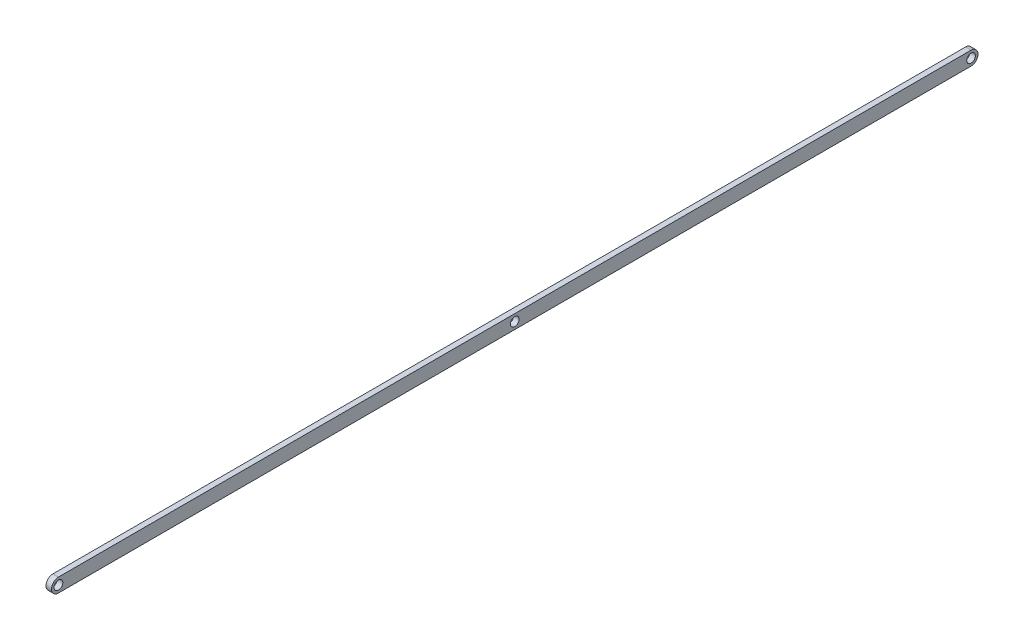
ISO-10303-21;
HEADER;
FILE_DESCRIPTION(('STEP AP214'),'2;1');
FILE_NAME('part.step','',(''),(''),'','','');
FILE_SCHEMA(('AUTOMOTIVE_DESIGN { 1 0 10303 214 1 1 1 1 }'));
ENDSEC;
DATA;
#1=APPLICATION_CONTEXT('core data for automotive mechanical design processes');
#2=APPLICATION_PROTOCOL_DEFINITION('international standard','automotive_design',2000,#1);
#3=PRODUCT_CONTEXT('',#1,'mechanical');
#4=PRODUCT('Part','Part','',(#3));
#5=PRODUCT_RELATED_PRODUCT_CATEGORY('part','',(#4));
#6=PRODUCT_DEFINITION_FORMATION('','',#4);
#7=PRODUCT_DEFINITION_CONTEXT('part definition',#1,'design');
#8=PRODUCT_DEFINITION('design','',#6,#7);
#9=PRODUCT_DEFINITION_SHAPE('','',#8);
#10=(LENGTH_UNIT() NAMED_UNIT(*) SI_UNIT(.MILLI.,.METRE.));
#11=(NAMED_UNIT(*) PLANE_ANGLE_UNIT() SI_UNIT($,.RADIAN.));
#12=(NAMED_UNIT(*) SI_UNIT($,.STERADIAN.) SOLID_ANGLE_UNIT());
#13=UNCERTAINTY_MEASURE_WITH_UNIT(LENGTH_MEASURE(1.E-05),#10,'distance_accuracy_value','');
#14=(GEOMETRIC_REPRESENTATION_CONTEXT(3) GLOBAL_UNCERTAINTY_ASSIGNED_CONTEXT((#13)) GLOBAL_UNIT_ASSIGNED_CONTEXT((#10,
#11,#12)) REPRESENTATION_CONTEXT('',''));
#15=CARTESIAN_POINT('',(0.,0.,0.));
#16=DIRECTION('',(0.,0.,1.));
#17=DIRECTION('',(1.,0.,0.));
#18=AXIS2_PLACEMENT_3D('',#15,#16,#17);
#19=CARTESIAN_POINT('',(5.08,0.,0.));
#20=DIRECTION('',(-1.,0.,0.));
#21=DIRECTION('',(0.,0.,1.));
#22=AXIS2_PLACEMENT_3D('',#19,#20,#21);
#23=PLANE('',#22);
#24=CARTESIAN_POINT('',(5.08,0.,0.));
#25=DIRECTION('',(1.,0.,0.));
#26=DIRECTION('',(0.,0.,-1.));
#27=AXIS2_PLACEMENT_3D('',#24,#25,#26);
#28=CIRCLE('',#27,3.99999999999997);
#29=CARTESIAN_POINT('',(5.08,0.,-3.99999999999997));
#30=VERTEX_POINT('',#29);
#31=EDGE_CURVE('E127',#30,#30,#28,.T.);
#32=ORIENTED_EDGE('',*,*,#31,.F.);
#33=EDGE_LOOP('',(#32));
#34=FACE_BOUND('',#33,.T.);
#35=CARTESIAN_POINT('',(5.08,0.,-419.1));
#36=DIRECTION('',(1.,0.,0.));
#37=DIRECTION('',(0.,0.,-1.));
#38=AXIS2_PLACEMENT_3D('',#35,#36,#37);
#39=CIRCLE('',#38,3.99999999999997);
#40=CARTESIAN_POINT('',(5.08,0.,-423.1));
#41=VERTEX_POINT('',#40);
#42=EDGE_CURVE('E115',#41,#41,#39,.T.);
#43=ORIENTED_EDGE('',*,*,#42,.F.);
#44=EDGE_LOOP('',(#43));
#45=FACE_BOUND('',#44,.T.);
#46=CARTESIAN_POINT('',(5.08,0.,0.));
#47=DIRECTION('',(1.,0.,0.));
#48=DIRECTION('',(0.,0.,1.));
#49=AXIS2_PLACEMENT_3D('',#46,#47,#48);
#50=CIRCLE('',#49,6.35);
#51=CARTESIAN_POINT('',(5.08,6.35,0.));
#52=VERTEX_POINT('',#51);
#53=CARTESIAN_POINT('',(5.08,-6.35,0.));
#54=VERTEX_POINT('',#53);
#55=EDGE_CURVE('E87',#52,#54,#50,.T.);
#56=ORIENTED_EDGE('',*,*,#55,.T.);
#57=DIRECTION('',(0.,0.,-1.));
#58=VECTOR('',#57,1.);
#59=CARTESIAN_POINT('',(5.08,-6.3499999999999,-838.2));
#60=LINE('',#59,#58);
#61=CARTESIAN_POINT('',(5.08,-6.3499999999999,-838.2));
#62=VERTEX_POINT('',#61);
#63=EDGE_CURVE('E82',#54,#62,#60,.T.);
#64=ORIENTED_EDGE('',*,*,#63,.T.);
#65=CARTESIAN_POINT('',(5.08,0.,-838.2));
#66=DIRECTION('',(1.,0.,0.));
#67=DIRECTION('',(0.,0.,-1.));
#68=AXIS2_PLACEMENT_3D('',#65,#66,#67);
#69=CIRCLE('',#68,6.34999999999995);
#70=CARTESIAN_POINT('',(5.08,6.35,-838.2));
#71=VERTEX_POINT('',#70);
#72=EDGE_CURVE('E85',#62,#71,#69,.T.);
#73=ORIENTED_EDGE('',*,*,#72,.T.);
#74=DIRECTION('',(0.,0.,1.));
#75=VECTOR('',#74,1.);
#76=CARTESIAN_POINT('',(5.08,6.35,0.));
#77=LINE('',#76,#75);
#78=EDGE_CURVE('E52',#71,#52,#77,.T.);
#79=ORIENTED_EDGE('',*,*,#78,.T.);
#80=EDGE_LOOP('',(#56,#64,#73,#79));
#81=FACE_BOUND('',#80,.T.);
#82=CARTESIAN_POINT('',(5.08,0.,-838.2));
#83=DIRECTION('',(1.,0.,0.));
#84=DIRECTION('',(0.,0.,-1.));
#85=AXIS2_PLACEMENT_3D('',#82,#83,#84);
#86=CIRCLE('',#85,3.99999999999997);
#87=CARTESIAN_POINT('',(5.08,0.,-842.2));
#88=VERTEX_POINT('',#87);
#89=EDGE_CURVE('E121',#88,#88,#86,.T.);
#90=ORIENTED_EDGE('',*,*,#89,.F.);
#91=EDGE_LOOP('',(#90));
#92=FACE_BOUND('',#91,.T.);
#93=ADVANCED_FACE('F35',(#34,#45,#81,#92),#23,.F.);
#94=CARTESIAN_POINT('',(5.08,0.,0.));
#95=DIRECTION('',(-1.,0.,0.));
#96=DIRECTION('',(0.,0.,1.));
#97=AXIS2_PLACEMENT_3D('',#94,#95,#96);
#98=CYLINDRICAL_SURFACE('',#97,6.35);
#99=CARTESIAN_POINT('',(0.,0.,0.));
#100=DIRECTION('',(1.,0.,0.));
#101=DIRECTION('',(0.,0.,1.));
#102=AXIS2_PLACEMENT_3D('',#99,#100,#101);
#103=CIRCLE('',#102,6.35);
#104=CARTESIAN_POINT('',(0.,6.35,0.));
#105=VERTEX_POINT('',#104);
#106=CARTESIAN_POINT('',(0.,-6.35,0.));
#107=VERTEX_POINT('',#106);
#108=EDGE_CURVE('E99',#105,#107,#103,.T.);
#109=ORIENTED_EDGE('',*,*,#108,.T.);
#110=DIRECTION('',(-1.,0.,0.));
#111=VECTOR('',#110,1.);
#112=CARTESIAN_POINT('',(5.08,-6.35,0.));
#113=LINE('',#112,#111);
#114=EDGE_CURVE('E11',#54,#107,#113,.T.);
#115=ORIENTED_EDGE('',*,*,#114,.F.);
#116=ORIENTED_EDGE('',*,*,#55,.F.);
#117=DIRECTION('',(-1.,0.,0.));
#118=VECTOR('',#117,1.);
#119=CARTESIAN_POINT('',(5.08,6.35,0.));
#120=LINE('',#119,#118);
#121=EDGE_CURVE('E95',#52,#105,#120,.T.);
#122=ORIENTED_EDGE('',*,*,#121,.T.);
#123=EDGE_LOOP('',(#109,#115,#116,#122));
#124=FACE_BOUND('',#123,.T.);
#125=ADVANCED_FACE('F37',(#124),#98,.T.);
#126=CARTESIAN_POINT('',(5.08,-6.3499999999999,-838.2));
#127=DIRECTION('',(0.,1.,0.));
#128=DIRECTION('',(0.,0.,1.));
#129=AXIS2_PLACEMENT_3D('',#126,#127,#128);
#130=PLANE('',#129);
#131=DIRECTION('',(0.,0.,-1.));
#132=VECTOR('',#131,1.);
#133=CARTESIAN_POINT('',(0.,-6.3499999999999,-838.2));
#134=LINE('',#133,#132);
#135=CARTESIAN_POINT('',(0.,-6.3499999999999,-838.2));
#136=VERTEX_POINT('',#135);
#137=EDGE_CURVE('E91',#107,#136,#134,.T.);
#138=ORIENTED_EDGE('',*,*,#137,.T.);
#139=DIRECTION('',(-1.,0.,0.));
#140=VECTOR('',#139,1.);
#141=CARTESIAN_POINT('',(5.08,-6.3499999999999,-838.2));
#142=LINE('',#141,#140);
#143=EDGE_CURVE('E44',#62,#136,#142,.T.);
#144=ORIENTED_EDGE('',*,*,#143,.F.);
#145=ORIENTED_EDGE('',*,*,#63,.F.);
#146=ORIENTED_EDGE('',*,*,#114,.T.);
#147=EDGE_LOOP('',(#138,#144,#145,#146));
#148=FACE_BOUND('',#147,.T.);
#149=ADVANCED_FACE('F90',(#148),#130,.F.);
#150=CARTESIAN_POINT('',(5.08,0.,-838.2));
#151=DIRECTION('',(-1.,0.,0.));
#152=DIRECTION('',(0.,0.,1.));
#153=AXIS2_PLACEMENT_3D('',#150,#151,#152);
#154=CYLINDRICAL_SURFACE('',#153,6.34999999999995);
#155=CARTESIAN_POINT('',(0.,0.,-838.2));
#156=DIRECTION('',(1.,0.,0.));
#157=DIRECTION('',(0.,0.,-1.));
#158=AXIS2_PLACEMENT_3D('',#155,#156,#157);
#159=CIRCLE('',#158,6.34999999999995);
#160=CARTESIAN_POINT('',(0.,6.35,-838.2));
#161=VERTEX_POINT('',#160);
#162=EDGE_CURVE('E69',#136,#161,#159,.T.);
#163=ORIENTED_EDGE('',*,*,#162,.T.);
#164=DIRECTION('',(-1.,0.,0.));
#165=VECTOR('',#164,1.);
#166=CARTESIAN_POINT('',(5.08,6.35,-838.2));
#167=LINE('',#166,#165);
#168=EDGE_CURVE('E92',#71,#161,#167,.T.);
#169=ORIENTED_EDGE('',*,*,#168,.F.);
#170=ORIENTED_EDGE('',*,*,#72,.F.);
#171=ORIENTED_EDGE('',*,*,#143,.T.);
#172=EDGE_LOOP('',(#163,#169,#170,#171));
#173=FACE_BOUND('',#172,.T.);
#174=ADVANCED_FACE('F93',(#173),#154,.T.);
#175=CARTESIAN_POINT('',(5.08,6.35,0.));
#176=DIRECTION('',(0.,-1.,0.));
#177=DIRECTION('',(0.,0.,-1.));
#178=AXIS2_PLACEMENT_3D('',#175,#176,#177);
#179=PLANE('',#178);
#180=DIRECTION('',(0.,0.,1.));
#181=VECTOR('',#180,1.);
#182=CARTESIAN_POINT('',(0.,6.35,0.));
#183=LINE('',#182,#181);
#184=EDGE_CURVE('E75',#161,#105,#183,.T.);
#185=ORIENTED_EDGE('',*,*,#184,.T.);
#186=ORIENTED_EDGE('',*,*,#121,.F.);
#187=ORIENTED_EDGE('',*,*,#78,.F.);
#188=ORIENTED_EDGE('',*,*,#168,.T.);
#189=EDGE_LOOP('',(#185,#186,#187,#188));
#190=FACE_BOUND('',#189,.T.);
#191=ADVANCED_FACE('F107',(#190),#179,.F.);
#192=CARTESIAN_POINT('',(0.,0.,0.));
#193=DIRECTION('',(-1.,0.,0.));
#194=DIRECTION('',(0.,0.,1.));
#195=AXIS2_PLACEMENT_3D('',#192,#193,#194);
#196=PLANE('',#195);
#197=CARTESIAN_POINT('',(0.,0.,0.));
#198=DIRECTION('',(1.,0.,0.));
#199=DIRECTION('',(0.,0.,-1.));
#200=AXIS2_PLACEMENT_3D('',#197,#198,#199);
#201=CIRCLE('',#200,4.);
#202=CARTESIAN_POINT('',(0.,0.,-4.));
#203=VERTEX_POINT('',#202);
#204=EDGE_CURVE('E124',#203,#203,#201,.T.);
#205=ORIENTED_EDGE('',*,*,#204,.T.);
#206=EDGE_LOOP('',(#205));
#207=FACE_BOUND('',#206,.T.);
#208=CARTESIAN_POINT('',(0.,0.,-838.2));
#209=DIRECTION('',(1.,0.,0.));
#210=DIRECTION('',(0.,0.,-1.));
#211=AXIS2_PLACEMENT_3D('',#208,#209,#210);
#212=CIRCLE('',#211,4.);
#213=CARTESIAN_POINT('',(0.,0.,-842.2));
#214=VERTEX_POINT('',#213);
#215=EDGE_CURVE('E118',#214,#214,#212,.T.);
#216=ORIENTED_EDGE('',*,*,#215,.T.);
#217=EDGE_LOOP('',(#216));
#218=FACE_BOUND('',#217,.T.);
#219=CARTESIAN_POINT('',(0.,0.,-419.1));
#220=DIRECTION('',(1.,0.,0.));
#221=DIRECTION('',(0.,0.,-1.));
#222=AXIS2_PLACEMENT_3D('',#219,#220,#221);
#223=CIRCLE('',#222,4.);
#224=CARTESIAN_POINT('',(0.,0.,-423.1));
#225=VERTEX_POINT('',#224);
#226=EDGE_CURVE('E102',#225,#225,#223,.T.);
#227=ORIENTED_EDGE('',*,*,#226,.T.);
#228=EDGE_LOOP('',(#227));
#229=FACE_BOUND('',#228,.T.);
#230=ORIENTED_EDGE('',*,*,#108,.F.);
#231=ORIENTED_EDGE('',*,*,#184,.F.);
#232=ORIENTED_EDGE('',*,*,#162,.F.);
#233=ORIENTED_EDGE('',*,*,#137,.F.);
#234=EDGE_LOOP('',(#230,#231,#232,#233));
#235=FACE_BOUND('',#234,.T.);
#236=ADVANCED_FACE('F110',(#207,#218,#229,#235),#196,.T.);
#237=CARTESIAN_POINT('',(5.08,0.,-419.1));
#238=DIRECTION('',(1.,0.,0.));
#239=DIRECTION('',(0.,0.,-1.));
#240=AXIS2_PLACEMENT_3D('',#237,#238,#239);
#241=CYLINDRICAL_SURFACE('',#240,3.99999999999998);
#242=ORIENTED_EDGE('',*,*,#226,.F.);
#243=EDGE_LOOP('',(#242));
#244=FACE_BOUND('',#243,.T.);
#245=ORIENTED_EDGE('',*,*,#42,.T.);
#246=EDGE_LOOP('',(#245));
#247=FACE_BOUND('',#246,.T.);
#248=ADVANCED_FACE('F138',(#244,#247),#241,.F.);
#249=CARTESIAN_POINT('',(5.08,0.,-838.2));
#250=DIRECTION('',(1.,0.,0.));
#251=DIRECTION('',(0.,0.,-1.));
#252=AXIS2_PLACEMENT_3D('',#249,#250,#251);
#253=CYLINDRICAL_SURFACE('',#252,3.99999999999998);
#254=ORIENTED_EDGE('',*,*,#215,.F.);
#255=EDGE_LOOP('',(#254));
#256=FACE_BOUND('',#255,.T.);
#257=ORIENTED_EDGE('',*,*,#89,.T.);
#258=EDGE_LOOP('',(#257));
#259=FACE_BOUND('',#258,.T.);
#260=ADVANCED_FACE('F140',(#256,#259),#253,.F.);
#261=CARTESIAN_POINT('',(5.08,0.,0.));
#262=DIRECTION('',(1.,0.,0.));
#263=DIRECTION('',(0.,0.,-1.));
#264=AXIS2_PLACEMENT_3D('',#261,#262,#263);
#265=CYLINDRICAL_SURFACE('',#264,3.99999999999998);
#266=ORIENTED_EDGE('',*,*,#204,.F.);
#267=EDGE_LOOP('',(#266));
#268=FACE_BOUND('',#267,.T.);
#269=ORIENTED_EDGE('',*,*,#31,.T.);
#270=EDGE_LOOP('',(#269));
#271=FACE_BOUND('',#270,.T.);
#272=ADVANCED_FACE('F131',(#268,#271),#265,.F.);
#273=CLOSED_SHELL('',(#93,#125,#149,#174,#191,#236,#248,#260,#272));
#274=MANIFOLD_SOLID_BREP('B2',#273);
#275=ADVANCED_BREP_SHAPE_REPRESENTATION('',(#18,#274),#14);
#276=SHAPE_DEFINITION_REPRESENTATION(#9,#275);
ENDSEC;
END-ISO-10303-21;
